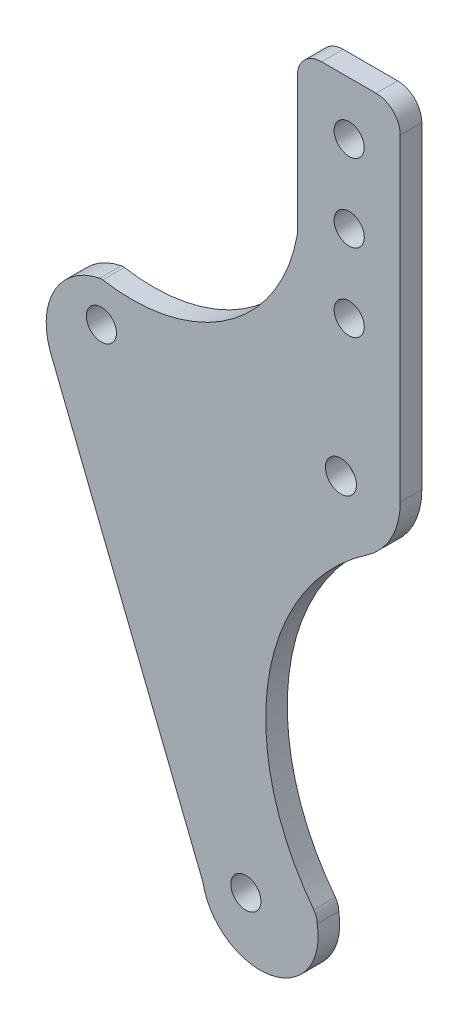
ISO-10303-21;
HEADER;
FILE_DESCRIPTION(('STEP AP214'),'2;1');
FILE_NAME('part.step','',(''),(''),'','','');
FILE_SCHEMA(('AUTOMOTIVE_DESIGN { 1 0 10303 214 1 1 1 1 }'));
ENDSEC;
DATA;
#1=APPLICATION_CONTEXT('core data for automotive mechanical design processes');
#2=APPLICATION_PROTOCOL_DEFINITION('international standard','automotive_design',2000,#1);
#3=PRODUCT_CONTEXT('',#1,'mechanical');
#4=PRODUCT('Part','Part','',(#3));
#5=PRODUCT_RELATED_PRODUCT_CATEGORY('part','',(#4));
#6=PRODUCT_DEFINITION_FORMATION('','',#4);
#7=PRODUCT_DEFINITION_CONTEXT('part definition',#1,'design');
#8=PRODUCT_DEFINITION('design','',#6,#7);
#9=PRODUCT_DEFINITION_SHAPE('','',#8);
#10=(LENGTH_UNIT() NAMED_UNIT(*) SI_UNIT(.MILLI.,.METRE.));
#11=(NAMED_UNIT(*) PLANE_ANGLE_UNIT() SI_UNIT($,.RADIAN.));
#12=(NAMED_UNIT(*) SI_UNIT($,.STERADIAN.) SOLID_ANGLE_UNIT());
#13=UNCERTAINTY_MEASURE_WITH_UNIT(LENGTH_MEASURE(1.E-05),#10,'distance_accuracy_value','');
#14=(GEOMETRIC_REPRESENTATION_CONTEXT(3) GLOBAL_UNCERTAINTY_ASSIGNED_CONTEXT((#13)) GLOBAL_UNIT_ASSIGNED_CONTEXT((#10,
#11,#12)) REPRESENTATION_CONTEXT('',''));
#15=CARTESIAN_POINT('',(0.,0.,0.));
#16=DIRECTION('',(0.,0.,1.));
#17=DIRECTION('',(1.,0.,0.));
#18=AXIS2_PLACEMENT_3D('',#15,#16,#17);
#19=CARTESIAN_POINT('',(-22.5782126898474,-20.4623195499468,3.175));
#20=DIRECTION('',(0.,0.,1.));
#21=DIRECTION('',(1.,0.,0.));
#22=AXIS2_PLACEMENT_3D('',#19,#20,#21);
#23=PLANE('',#22);
#24=CARTESIAN_POINT('',(-20.2675102016368,-21.5168908609178,3.175));
#25=DIRECTION('',(0.,0.,1.));
#26=DIRECTION('',(1.,0.,0.));
#27=AXIS2_PLACEMENT_3D('',#24,#25,#26);
#28=CIRCLE('',#27,2.286);
#29=CARTESIAN_POINT('',(-17.9815102016368,-21.5168908609178,3.175));
#30=VERTEX_POINT('',#29);
#31=EDGE_CURVE('E294',#30,#30,#28,.T.);
#32=ORIENTED_EDGE('',*,*,#31,.F.);
#33=EDGE_LOOP('',(#32));
#34=FACE_BOUND('',#33,.T.);
#35=CARTESIAN_POINT('',(-19.05,10.6549552352061,3.175));
#36=DIRECTION('',(0.,0.,1.));
#37=DIRECTION('',(1.,0.,0.));
#38=AXIS2_PLACEMENT_3D('',#35,#36,#37);
#39=CIRCLE('',#38,2.2225);
#40=CARTESIAN_POINT('',(-16.8275,10.6549552352061,3.175));
#41=VERTEX_POINT('',#40);
#42=EDGE_CURVE('E299',#41,#41,#39,.T.);
#43=ORIENTED_EDGE('',*,*,#42,.F.);
#44=EDGE_LOOP('',(#43));
#45=FACE_BOUND('',#44,.T.);
#46=CARTESIAN_POINT('',(-19.05,22.0849552352061,3.175));
#47=DIRECTION('',(0.,0.,1.));
#48=DIRECTION('',(1.,0.,0.));
#49=AXIS2_PLACEMENT_3D('',#46,#47,#48);
#50=CIRCLE('',#49,2.2225);
#51=CARTESIAN_POINT('',(-16.8275,22.0849552352061,3.175));
#52=VERTEX_POINT('',#51);
#53=EDGE_CURVE('E309',#52,#52,#50,.T.);
#54=ORIENTED_EDGE('',*,*,#53,.F.);
#55=EDGE_LOOP('',(#54));
#56=FACE_BOUND('',#55,.T.);
#57=CARTESIAN_POINT('',(-22.5782126898474,-20.4623195499468,3.175));
#58=DIRECTION('',(0.,0.,1.));
#59=DIRECTION('',(1.,0.,0.));
#60=AXIS2_PLACEMENT_3D('',#57,#58,#59);
#61=CIRCLE('',#60,11.0500735383556);
#62=CARTESIAN_POINT('',(-16.3570102645019,-29.5947215114212,3.175));
#63=VERTEX_POINT('',#62);
#64=CARTESIAN_POINT('',(-11.5281391514918,-20.4623195499468,3.175));
#65=VERTEX_POINT('',#64);
#66=EDGE_CURVE('E213',#63,#65,#61,.T.);
#67=ORIENTED_EDGE('',*,*,#66,.T.);
#68=DIRECTION('',(0.,1.,0.));
#69=VECTOR('',#68,1.);
#70=CARTESIAN_POINT('',(-11.5281391514918,-20.4623195499468,3.175));
#71=LINE('',#70,#69);
#72=CARTESIAN_POINT('',(-11.5281391514918,26.3577225871405,3.175));
#73=VERTEX_POINT('',#72);
#74=EDGE_CURVE('E127',#65,#73,#71,.T.);
#75=ORIENTED_EDGE('',*,*,#74,.T.);
#76=CARTESIAN_POINT('',(-15.0841391514918,26.3577225871405,3.175));
#77=DIRECTION('',(0.,0.,1.));
#78=DIRECTION('',(-1.,0.,0.));
#79=AXIS2_PLACEMENT_3D('',#76,#77,#78);
#80=CIRCLE('',#79,3.556);
#81=CARTESIAN_POINT('',(-15.0841391514918,29.9137225871405,3.175));
#82=VERTEX_POINT('',#81);
#83=EDGE_CURVE('E246',#73,#82,#80,.T.);
#84=ORIENTED_EDGE('',*,*,#83,.T.);
#85=DIRECTION('',(-1.,0.,0.));
#86=VECTOR('',#85,1.);
#87=CARTESIAN_POINT('',(-15.0841391514918,29.9137225871405,3.175));
#88=LINE('',#87,#86);
#89=CARTESIAN_POINT('',(-23.1269689628182,29.9137225871405,3.175));
#90=VERTEX_POINT('',#89);
#91=EDGE_CURVE('E266',#82,#90,#88,.T.);
#92=ORIENTED_EDGE('',*,*,#91,.T.);
#93=CARTESIAN_POINT('',(-23.1269689628182,26.3577225871405,3.175));
#94=DIRECTION('',(0.,0.,1.));
#95=DIRECTION('',(1.,0.,0.));
#96=AXIS2_PLACEMENT_3D('',#93,#94,#95);
#97=CIRCLE('',#96,3.556);
#98=CARTESIAN_POINT('',(-26.6829689628182,26.3577225871405,3.175));
#99=VERTEX_POINT('',#98);
#100=EDGE_CURVE('E263',#90,#99,#97,.T.);
#101=ORIENTED_EDGE('',*,*,#100,.T.);
#102=DIRECTION('',(0.,-1.,0.));
#103=VECTOR('',#102,1.);
#104=CARTESIAN_POINT('',(-26.6829689628182,26.3577225871405,3.175));
#105=LINE('',#104,#103);
#106=CARTESIAN_POINT('',(-26.6829689628181,6.35178587229873,3.175));
#107=VERTEX_POINT('',#106);
#108=EDGE_CURVE('E264',#99,#107,#105,.T.);
#109=ORIENTED_EDGE('',*,*,#108,.T.);
#110=CARTESIAN_POINT('',(-29.2229689628182,6.35178587229873,3.175));
#111=DIRECTION('',(0.,0.,-1.));
#112=DIRECTION('',(-1.,0.,0.));
#113=AXIS2_PLACEMENT_3D('',#110,#111,#112);
#114=CIRCLE('',#113,2.54);
#115=CARTESIAN_POINT('',(-26.7251145628576,5.89100024253371,3.175));
#116=VERTEX_POINT('',#115);
#117=EDGE_CURVE('E268',#107,#116,#114,.T.);
#118=ORIENTED_EDGE('',*,*,#117,.T.);
#119=CARTESIAN_POINT('',(-51.0844467454906,10.3846289426721,3.175));
#120=DIRECTION('',(0.,0.,-1.));
#121=DIRECTION('',(1.,0.,0.));
#122=AXIS2_PLACEMENT_3D('',#119,#120,#121);
#123=CIRCLE('',#122,24.770340394887);
#124=CARTESIAN_POINT('',(-55.3282039653007,-14.0194749732245,3.175));
#125=VERTEX_POINT('',#124);
#126=EDGE_CURVE('E273',#116,#125,#123,.T.);
#127=ORIENTED_EDGE('',*,*,#126,.T.);
#128=CARTESIAN_POINT('',(-55.5391522855915,-15.2325520798106,3.175));
#129=DIRECTION('',(0.,0.,1.));
#130=DIRECTION('',(1.,0.,0.));
#131=AXIS2_PLACEMENT_3D('',#128,#129,#130);
#132=CIRCLE('',#131,1.23128195810575);
#133=CARTESIAN_POINT('',(-55.7802230548623,-14.0251001575545,3.175));
#134=VERTEX_POINT('',#133);
#135=EDGE_CURVE('E280',#125,#134,#132,.T.);
#136=ORIENTED_EDGE('',*,*,#135,.T.);
#137=CARTESIAN_POINT('',(-53.857760548183,-23.6541441771838,3.175));
#138=DIRECTION('',(0.,0.,1.));
#139=DIRECTION('',(-1.,0.,0.));
#140=AXIS2_PLACEMENT_3D('',#137,#138,#139);
#141=CIRCLE('',#140,9.81908095605417);
#142=CARTESIAN_POINT('',(-63.1033724051803,-26.9606547565251,3.175));
#143=VERTEX_POINT('',#142);
#144=EDGE_CURVE('E276',#134,#143,#141,.T.);
#145=ORIENTED_EDGE('',*,*,#144,.T.);
#146=DIRECTION('',(0.370104767330601,-0.928990022120346,0.));
#147=VECTOR('',#146,1.);
#148=CARTESIAN_POINT('',(-63.1033724051803,-26.9606547565251,3.175));
#149=LINE('',#148,#147);
#150=CARTESIAN_POINT('',(-40.5959446251079,-83.4559438663901,3.175));
#151=VERTEX_POINT('',#150);
#152=EDGE_CURVE('E162',#143,#151,#149,.T.);
#153=ORIENTED_EDGE('',*,*,#152,.T.);
#154=CARTESIAN_POINT('',(-32.1769095073306,-81.9203867356407,3.175));
#155=DIRECTION('',(0.,0.,1.));
#156=DIRECTION('',(1.,0.,0.));
#157=AXIS2_PLACEMENT_3D('',#154,#155,#156);
#158=CIRCLE('',#157,8.55792545049101);
#159=CARTESIAN_POINT('',(-23.7578743895534,-80.3848296048913,3.175));
#160=VERTEX_POINT('',#159);
#161=EDGE_CURVE('E160',#151,#160,#158,.T.);
#162=ORIENTED_EDGE('',*,*,#161,.T.);
#163=CARTESIAN_POINT('',(-26.2975817528902,-80.3462743379001,3.175));
#164=DIRECTION('',(0.,0.,1.));
#165=DIRECTION('',(1.,0.,0.));
#166=AXIS2_PLACEMENT_3D('',#163,#164,#165);
#167=CIRCLE('',#166,2.54000000000001);
#168=CARTESIAN_POINT('',(-24.2808678537759,-78.8021030232075,3.175));
#169=VERTEX_POINT('',#168);
#170=EDGE_CURVE('E161',#160,#169,#167,.T.);
#171=ORIENTED_EDGE('',*,*,#170,.T.);
#172=CARTESIAN_POINT('',(2.9568838511131,-57.9465146931633,3.175));
#173=DIRECTION('',(0.,0.,-1.));
#174=DIRECTION('',(1.,0.,0.));
#175=AXIS2_PLACEMENT_3D('',#172,#173,#174);
#176=CIRCLE('',#175,34.3052573599071);
#177=EDGE_CURVE('E65',#169,#63,#176,.T.);
#178=ORIENTED_EDGE('',*,*,#177,.T.);
#179=EDGE_LOOP('',(#67,#75,#84,#92,#101,#109,#118,#127,#136,#145,#153,#162,#171,#178));
#180=FACE_BOUND('',#179,.T.);
#181=CARTESIAN_POINT('',(-55.5440786790482,-19.8249649015272,3.175));
#182=DIRECTION('',(0.,0.,1.));
#183=DIRECTION('',(1.,0.,0.));
#184=AXIS2_PLACEMENT_3D('',#181,#182,#183);
#185=CIRCLE('',#184,2.22250000000152);
#186=CARTESIAN_POINT('',(-53.3215786790467,-19.8249649015272,3.175));
#187=VERTEX_POINT('',#186);
#188=EDGE_CURVE('E187',#187,#187,#185,.T.);
#189=ORIENTED_EDGE('',*,*,#188,.F.);
#190=EDGE_LOOP('',(#189));
#191=FACE_BOUND('',#190,.T.);
#192=CARTESIAN_POINT('',(-19.05,-0.77504476479388,3.175));
#193=DIRECTION('',(0.,0.,1.));
#194=DIRECTION('',(1.,0.,0.));
#195=AXIS2_PLACEMENT_3D('',#192,#193,#194);
#196=CIRCLE('',#195,2.2225);
#197=CARTESIAN_POINT('',(-16.8275,-0.77504476479388,3.175));
#198=VERTEX_POINT('',#197);
#199=EDGE_CURVE('E303',#198,#198,#196,.T.);
#200=ORIENTED_EDGE('',*,*,#199,.F.);
#201=EDGE_LOOP('',(#200));
#202=FACE_BOUND('',#201,.T.);
#203=CARTESIAN_POINT('',(-34.2687021771766,-81.6511114563678,3.175));
#204=DIRECTION('',(0.,0.,1.));
#205=DIRECTION('',(1.,0.,0.));
#206=AXIS2_PLACEMENT_3D('',#203,#204,#205);
#207=CIRCLE('',#206,2.22250000000154);
#208=CARTESIAN_POINT('',(-32.0462021771751,-81.6511114563678,3.175));
#209=VERTEX_POINT('',#208);
#210=EDGE_CURVE('E283',#209,#209,#207,.T.);
#211=ORIENTED_EDGE('',*,*,#210,.F.);
#212=EDGE_LOOP('',(#211));
#213=FACE_BOUND('',#212,.T.);
#214=ADVANCED_FACE('F50',(#34,#45,#56,#180,#191,#202,#213),#23,.T.);
#215=CARTESIAN_POINT('',(-22.5782126898474,-20.4623195499468,0.));
#216=DIRECTION('',(0.,0.,1.));
#217=DIRECTION('',(1.,0.,0.));
#218=AXIS2_PLACEMENT_3D('',#215,#216,#217);
#219=PLANE('',#218);
#220=CARTESIAN_POINT('',(-20.2675102016368,-21.5168908609178,0.));
#221=DIRECTION('',(0.,0.,1.));
#222=DIRECTION('',(1.,0.,0.));
#223=AXIS2_PLACEMENT_3D('',#220,#221,#222);
#224=CIRCLE('',#223,2.286);
#225=CARTESIAN_POINT('',(-17.9815102016368,-21.5168908609178,0.));
#226=VERTEX_POINT('',#225);
#227=EDGE_CURVE('E285',#226,#226,#224,.T.);
#228=ORIENTED_EDGE('',*,*,#227,.T.);
#229=EDGE_LOOP('',(#228));
#230=FACE_BOUND('',#229,.T.);
#231=CARTESIAN_POINT('',(-22.5782126898474,-20.4623195499468,0.));
#232=DIRECTION('',(0.,0.,1.));
#233=DIRECTION('',(1.,0.,0.));
#234=AXIS2_PLACEMENT_3D('',#231,#232,#233);
#235=CIRCLE('',#234,11.0500735383556);
#236=CARTESIAN_POINT('',(-16.3570102645019,-29.5947215114212,0.));
#237=VERTEX_POINT('',#236);
#238=CARTESIAN_POINT('',(-11.5281391514918,-20.4623195499468,0.));
#239=VERTEX_POINT('',#238);
#240=EDGE_CURVE('E185',#237,#239,#235,.T.);
#241=ORIENTED_EDGE('',*,*,#240,.F.);
#242=CARTESIAN_POINT('',(2.9568838511131,-57.9465146931633,0.));
#243=DIRECTION('',(0.,0.,-1.));
#244=DIRECTION('',(1.,0.,0.));
#245=AXIS2_PLACEMENT_3D('',#242,#243,#244);
#246=CIRCLE('',#245,34.3052573599071);
#247=CARTESIAN_POINT('',(-24.2808678537759,-78.8021030232075,0.));
#248=VERTEX_POINT('',#247);
#249=EDGE_CURVE('E119',#248,#237,#246,.T.);
#250=ORIENTED_EDGE('',*,*,#249,.F.);
#251=CARTESIAN_POINT('',(-26.2975817528902,-80.3462743379001,0.));
#252=DIRECTION('',(0.,0.,1.));
#253=DIRECTION('',(1.,0.,0.));
#254=AXIS2_PLACEMENT_3D('',#251,#252,#253);
#255=CIRCLE('',#254,2.54000000000001);
#256=CARTESIAN_POINT('',(-23.7578743895534,-80.3848296048913,0.));
#257=VERTEX_POINT('',#256);
#258=EDGE_CURVE('E115',#257,#248,#255,.T.);
#259=ORIENTED_EDGE('',*,*,#258,.F.);
#260=CARTESIAN_POINT('',(-32.1769095073306,-81.9203867356407,0.));
#261=DIRECTION('',(0.,0.,1.));
#262=DIRECTION('',(1.,0.,0.));
#263=AXIS2_PLACEMENT_3D('',#260,#261,#262);
#264=CIRCLE('',#263,8.55792545049101);
#265=CARTESIAN_POINT('',(-40.5959446251079,-83.4559438663901,0.));
#266=VERTEX_POINT('',#265);
#267=EDGE_CURVE('E171',#266,#257,#264,.T.);
#268=ORIENTED_EDGE('',*,*,#267,.F.);
#269=DIRECTION('',(0.370104767330601,-0.928990022120346,0.));
#270=VECTOR('',#269,1.);
#271=CARTESIAN_POINT('',(-63.1033724051803,-26.9606547565251,0.));
#272=LINE('',#271,#270);
#273=CARTESIAN_POINT('',(-63.1033724051803,-26.9606547565251,0.));
#274=VERTEX_POINT('',#273);
#275=EDGE_CURVE('E206',#274,#266,#272,.T.);
#276=ORIENTED_EDGE('',*,*,#275,.F.);
#277=CARTESIAN_POINT('',(-53.857760548183,-23.6541441771838,0.));
#278=DIRECTION('',(0.,0.,1.));
#279=DIRECTION('',(-1.,0.,0.));
#280=AXIS2_PLACEMENT_3D('',#277,#278,#279);
#281=CIRCLE('',#280,9.81908095605417);
#282=CARTESIAN_POINT('',(-55.7802230548623,-14.0251001575545,0.));
#283=VERTEX_POINT('',#282);
#284=EDGE_CURVE('E204',#283,#274,#281,.T.);
#285=ORIENTED_EDGE('',*,*,#284,.F.);
#286=CARTESIAN_POINT('',(-55.5391522855915,-15.2325520798106,0.));
#287=DIRECTION('',(0.,0.,1.));
#288=DIRECTION('',(1.,0.,0.));
#289=AXIS2_PLACEMENT_3D('',#286,#287,#288);
#290=CIRCLE('',#289,1.23128195810575);
#291=CARTESIAN_POINT('',(-55.3282039653007,-14.0194749732245,0.));
#292=VERTEX_POINT('',#291);
#293=EDGE_CURVE('E205',#292,#283,#290,.T.);
#294=ORIENTED_EDGE('',*,*,#293,.F.);
#295=CARTESIAN_POINT('',(-51.0844467454906,10.3846289426721,0.));
#296=DIRECTION('',(0.,0.,-1.));
#297=DIRECTION('',(1.,0.,0.));
#298=AXIS2_PLACEMENT_3D('',#295,#296,#297);
#299=CIRCLE('',#298,24.770340394887);
#300=CARTESIAN_POINT('',(-26.7251145628576,5.89100024253371,0.));
#301=VERTEX_POINT('',#300);
#302=EDGE_CURVE('E200',#301,#292,#299,.T.);
#303=ORIENTED_EDGE('',*,*,#302,.F.);
#304=CARTESIAN_POINT('',(-29.2229689628182,6.35178587229873,0.));
#305=DIRECTION('',(0.,0.,-1.));
#306=DIRECTION('',(-1.,0.,0.));
#307=AXIS2_PLACEMENT_3D('',#304,#305,#306);
#308=CIRCLE('',#307,2.54);
#309=CARTESIAN_POINT('',(-26.6829689628181,6.35178587229873,0.));
#310=VERTEX_POINT('',#309);
#311=EDGE_CURVE('E197',#310,#301,#308,.T.);
#312=ORIENTED_EDGE('',*,*,#311,.F.);
#313=DIRECTION('',(0.,-1.,0.));
#314=VECTOR('',#313,1.);
#315=CARTESIAN_POINT('',(-26.6829689628182,26.3577225871405,0.));
#316=LINE('',#315,#314);
#317=CARTESIAN_POINT('',(-26.6829689628182,26.3577225871405,0.));
#318=VERTEX_POINT('',#317);
#319=EDGE_CURVE('E192',#318,#310,#316,.T.);
#320=ORIENTED_EDGE('',*,*,#319,.F.);
#321=CARTESIAN_POINT('',(-23.1269689628182,26.3577225871405,0.));
#322=DIRECTION('',(0.,0.,1.));
#323=DIRECTION('',(1.,0.,0.));
#324=AXIS2_PLACEMENT_3D('',#321,#322,#323);
#325=CIRCLE('',#324,3.556);
#326=CARTESIAN_POINT('',(-23.1269689628182,29.9137225871405,0.));
#327=VERTEX_POINT('',#326);
#328=EDGE_CURVE('E195',#327,#318,#325,.T.);
#329=ORIENTED_EDGE('',*,*,#328,.F.);
#330=DIRECTION('',(-1.,0.,0.));
#331=VECTOR('',#330,1.);
#332=CARTESIAN_POINT('',(-15.0841391514918,29.9137225871405,0.));
#333=LINE('',#332,#331);
#334=CARTESIAN_POINT('',(-15.0841391514918,29.9137225871405,0.));
#335=VERTEX_POINT('',#334);
#336=EDGE_CURVE('E194',#335,#327,#333,.T.);
#337=ORIENTED_EDGE('',*,*,#336,.F.);
#338=CARTESIAN_POINT('',(-15.0841391514918,26.3577225871405,0.));
#339=DIRECTION('',(0.,0.,1.));
#340=DIRECTION('',(-1.,0.,0.));
#341=AXIS2_PLACEMENT_3D('',#338,#339,#340);
#342=CIRCLE('',#341,3.556);
#343=CARTESIAN_POINT('',(-11.5281391514918,26.3577225871405,0.));
#344=VERTEX_POINT('',#343);
#345=EDGE_CURVE('E188',#344,#335,#342,.T.);
#346=ORIENTED_EDGE('',*,*,#345,.F.);
#347=DIRECTION('',(0.,1.,0.));
#348=VECTOR('',#347,1.);
#349=CARTESIAN_POINT('',(-11.5281391514918,-20.4623195499468,0.));
#350=LINE('',#349,#348);
#351=EDGE_CURVE('E186',#239,#344,#350,.T.);
#352=ORIENTED_EDGE('',*,*,#351,.F.);
#353=EDGE_LOOP('',(#241,#250,#259,#268,#276,#285,#294,#303,#312,#320,#329,#337,#346,#352));
#354=FACE_BOUND('',#353,.T.);
#355=CARTESIAN_POINT('',(-55.5440786790482,-19.8249649015272,0.));
#356=DIRECTION('',(0.,0.,1.));
#357=DIRECTION('',(1.,0.,0.));
#358=AXIS2_PLACEMENT_3D('',#355,#356,#357);
#359=CIRCLE('',#358,2.22250000000152);
#360=CARTESIAN_POINT('',(-53.3215786790467,-19.8249649015272,0.));
#361=VERTEX_POINT('',#360);
#362=EDGE_CURVE('E311',#361,#361,#359,.T.);
#363=ORIENTED_EDGE('',*,*,#362,.T.);
#364=EDGE_LOOP('',(#363));
#365=FACE_BOUND('',#364,.T.);
#366=CARTESIAN_POINT('',(-19.05,22.0849552352061,0.));
#367=DIRECTION('',(0.,0.,1.));
#368=DIRECTION('',(1.,0.,0.));
#369=AXIS2_PLACEMENT_3D('',#366,#367,#368);
#370=CIRCLE('',#369,2.2225);
#371=CARTESIAN_POINT('',(-16.8275,22.0849552352061,0.));
#372=VERTEX_POINT('',#371);
#373=EDGE_CURVE('E307',#372,#372,#370,.T.);
#374=ORIENTED_EDGE('',*,*,#373,.T.);
#375=EDGE_LOOP('',(#374));
#376=FACE_BOUND('',#375,.T.);
#377=CARTESIAN_POINT('',(-19.05,-0.77504476479388,0.));
#378=DIRECTION('',(0.,0.,1.));
#379=DIRECTION('',(1.,0.,0.));
#380=AXIS2_PLACEMENT_3D('',#377,#378,#379);
#381=CIRCLE('',#380,2.2225);
#382=CARTESIAN_POINT('',(-16.8275,-0.77504476479388,0.));
#383=VERTEX_POINT('',#382);
#384=EDGE_CURVE('E304',#383,#383,#381,.T.);
#385=ORIENTED_EDGE('',*,*,#384,.T.);
#386=EDGE_LOOP('',(#385));
#387=FACE_BOUND('',#386,.T.);
#388=CARTESIAN_POINT('',(-19.05,10.6549552352061,0.));
#389=DIRECTION('',(0.,0.,1.));
#390=DIRECTION('',(1.,0.,0.));
#391=AXIS2_PLACEMENT_3D('',#388,#389,#390);
#392=CIRCLE('',#391,2.2225);
#393=CARTESIAN_POINT('',(-16.8275,10.6549552352061,0.));
#394=VERTEX_POINT('',#393);
#395=EDGE_CURVE('E287',#394,#394,#392,.T.);
#396=ORIENTED_EDGE('',*,*,#395,.T.);
#397=EDGE_LOOP('',(#396));
#398=FACE_BOUND('',#397,.T.);
#399=CARTESIAN_POINT('',(-34.2687021771766,-81.6511114563678,0.));
#400=DIRECTION('',(0.,0.,1.));
#401=DIRECTION('',(1.,0.,0.));
#402=AXIS2_PLACEMENT_3D('',#399,#400,#401);
#403=CIRCLE('',#402,2.22250000000154);
#404=CARTESIAN_POINT('',(-32.0462021771751,-81.6511114563678,0.));
#405=VERTEX_POINT('',#404);
#406=EDGE_CURVE('E282',#405,#405,#403,.T.);
#407=ORIENTED_EDGE('',*,*,#406,.T.);
#408=EDGE_LOOP('',(#407));
#409=FACE_BOUND('',#408,.T.);
#410=ADVANCED_FACE('F253',(#230,#354,#365,#376,#387,#398,#409),#219,.F.);
#411=CARTESIAN_POINT('',(-22.5782126898474,-20.4623195499468,3.175));
#412=DIRECTION('',(0.,0.,-1.));
#413=DIRECTION('',(-1.,0.,0.));
#414=AXIS2_PLACEMENT_3D('',#411,#412,#413);
#415=CYLINDRICAL_SURFACE('',#414,11.0500735383556);
#416=ORIENTED_EDGE('',*,*,#240,.T.);
#417=DIRECTION('',(0.,0.,-1.));
#418=VECTOR('',#417,1.);
#419=CARTESIAN_POINT('',(-11.5281391514918,-20.4623195499468,3.175));
#420=LINE('',#419,#418);
#421=EDGE_CURVE('E11',#65,#239,#420,.T.);
#422=ORIENTED_EDGE('',*,*,#421,.F.);
#423=ORIENTED_EDGE('',*,*,#66,.F.);
#424=DIRECTION('',(0.,0.,-1.));
#425=VECTOR('',#424,1.);
#426=CARTESIAN_POINT('',(-16.3570102645019,-29.5947215114212,3.175));
#427=LINE('',#426,#425);
#428=EDGE_CURVE('E180',#63,#237,#427,.T.);
#429=ORIENTED_EDGE('',*,*,#428,.T.);
#430=EDGE_LOOP('',(#416,#422,#423,#429));
#431=FACE_BOUND('',#430,.T.);
#432=ADVANCED_FACE('F47',(#431),#415,.T.);
#433=CARTESIAN_POINT('',(-11.5281391514918,-20.4623195499468,3.175));
#434=DIRECTION('',(-1.,0.,0.));
#435=DIRECTION('',(0.,0.,1.));
#436=AXIS2_PLACEMENT_3D('',#433,#434,#435);
#437=PLANE('',#436);
#438=ORIENTED_EDGE('',*,*,#351,.T.);
#439=DIRECTION('',(0.,0.,-1.));
#440=VECTOR('',#439,1.);
#441=CARTESIAN_POINT('',(-11.5281391514918,26.3577225871405,3.175));
#442=LINE('',#441,#440);
#443=EDGE_CURVE('E57',#73,#344,#442,.T.);
#444=ORIENTED_EDGE('',*,*,#443,.F.);
#445=ORIENTED_EDGE('',*,*,#74,.F.);
#446=ORIENTED_EDGE('',*,*,#421,.T.);
#447=EDGE_LOOP('',(#438,#444,#445,#446));
#448=FACE_BOUND('',#447,.T.);
#449=ADVANCED_FACE('F324',(#448),#437,.F.);
#450=CARTESIAN_POINT('',(-15.0841391514918,26.3577225871405,3.175));
#451=DIRECTION('',(0.,0.,-1.));
#452=DIRECTION('',(-1.,0.,0.));
#453=AXIS2_PLACEMENT_3D('',#450,#451,#452);
#454=CYLINDRICAL_SURFACE('',#453,3.556);
#455=ORIENTED_EDGE('',*,*,#345,.T.);
#456=DIRECTION('',(0.,0.,-1.));
#457=VECTOR('',#456,1.);
#458=CARTESIAN_POINT('',(-15.0841391514918,29.9137225871405,3.175));
#459=LINE('',#458,#457);
#460=EDGE_CURVE('E239',#82,#335,#459,.T.);
#461=ORIENTED_EDGE('',*,*,#460,.F.);
#462=ORIENTED_EDGE('',*,*,#83,.F.);
#463=ORIENTED_EDGE('',*,*,#443,.T.);
#464=EDGE_LOOP('',(#455,#461,#462,#463));
#465=FACE_BOUND('',#464,.T.);
#466=ADVANCED_FACE('F245',(#465),#454,.T.);
#467=CARTESIAN_POINT('',(-15.0841391514918,29.9137225871405,3.175));
#468=DIRECTION('',(0.,-1.,0.));
#469=DIRECTION('',(1.,0.,0.));
#470=AXIS2_PLACEMENT_3D('',#467,#468,#469);
#471=PLANE('',#470);
#472=ORIENTED_EDGE('',*,*,#336,.T.);
#473=DIRECTION('',(0.,0.,-1.));
#474=VECTOR('',#473,1.);
#475=CARTESIAN_POINT('',(-23.1269689628182,29.9137225871405,3.175));
#476=LINE('',#475,#474);
#477=EDGE_CURVE('E237',#90,#327,#476,.T.);
#478=ORIENTED_EDGE('',*,*,#477,.F.);
#479=ORIENTED_EDGE('',*,*,#91,.F.);
#480=ORIENTED_EDGE('',*,*,#460,.T.);
#481=EDGE_LOOP('',(#472,#478,#479,#480));
#482=FACE_BOUND('',#481,.T.);
#483=ADVANCED_FACE('F260',(#482),#471,.F.);
#484=CARTESIAN_POINT('',(-23.1269689628182,26.3577225871405,3.175));
#485=DIRECTION('',(0.,0.,-1.));
#486=DIRECTION('',(-1.,0.,0.));
#487=AXIS2_PLACEMENT_3D('',#484,#485,#486);
#488=CYLINDRICAL_SURFACE('',#487,3.556);
#489=ORIENTED_EDGE('',*,*,#328,.T.);
#490=DIRECTION('',(0.,0.,-1.));
#491=VECTOR('',#490,1.);
#492=CARTESIAN_POINT('',(-26.6829689628182,26.3577225871405,3.175));
#493=LINE('',#492,#491);
#494=EDGE_CURVE('E235',#99,#318,#493,.T.);
#495=ORIENTED_EDGE('',*,*,#494,.F.);
#496=ORIENTED_EDGE('',*,*,#100,.F.);
#497=ORIENTED_EDGE('',*,*,#477,.T.);
#498=EDGE_LOOP('',(#489,#495,#496,#497));
#499=FACE_BOUND('',#498,.T.);
#500=ADVANCED_FACE('F261',(#499),#488,.T.);
#501=CARTESIAN_POINT('',(-26.6829689628182,26.3577225871405,3.175));
#502=DIRECTION('',(1.,0.,0.));
#503=DIRECTION('',(0.,1.,0.));
#504=AXIS2_PLACEMENT_3D('',#501,#502,#503);
#505=PLANE('',#504);
#506=ORIENTED_EDGE('',*,*,#319,.T.);
#507=DIRECTION('',(0.,0.,-1.));
#508=VECTOR('',#507,1.);
#509=CARTESIAN_POINT('',(-26.6829689628181,6.35178587229873,3.175));
#510=LINE('',#509,#508);
#511=EDGE_CURVE('E230',#107,#310,#510,.T.);
#512=ORIENTED_EDGE('',*,*,#511,.F.);
#513=ORIENTED_EDGE('',*,*,#108,.F.);
#514=ORIENTED_EDGE('',*,*,#494,.T.);
#515=EDGE_LOOP('',(#506,#512,#513,#514));
#516=FACE_BOUND('',#515,.T.);
#517=ADVANCED_FACE('F375',(#516),#505,.F.);
#518=CARTESIAN_POINT('',(-29.2229689628182,6.35178587229873,3.175));
#519=DIRECTION('',(0.,0.,-1.));
#520=DIRECTION('',(-1.,0.,0.));
#521=AXIS2_PLACEMENT_3D('',#518,#519,#520);
#522=CYLINDRICAL_SURFACE('',#521,2.54);
#523=ORIENTED_EDGE('',*,*,#311,.T.);
#524=DIRECTION('',(0.,0.,-1.));
#525=VECTOR('',#524,1.);
#526=CARTESIAN_POINT('',(-26.7251145628576,5.89100024253371,3.175));
#527=LINE('',#526,#525);
#528=EDGE_CURVE('E227',#116,#301,#527,.T.);
#529=ORIENTED_EDGE('',*,*,#528,.F.);
#530=ORIENTED_EDGE('',*,*,#117,.F.);
#531=ORIENTED_EDGE('',*,*,#511,.T.);
#532=EDGE_LOOP('',(#523,#529,#530,#531));
#533=FACE_BOUND('',#532,.T.);
#534=ADVANCED_FACE('F366',(#533),#522,.F.);
#535=CARTESIAN_POINT('',(-51.0844467454906,10.3846289426721,3.175));
#536=DIRECTION('',(0.,0.,-1.));
#537=DIRECTION('',(-1.,0.,0.));
#538=AXIS2_PLACEMENT_3D('',#535,#536,#537);
#539=CYLINDRICAL_SURFACE('',#538,24.770340394887);
#540=ORIENTED_EDGE('',*,*,#302,.T.);
#541=DIRECTION('',(0.,0.,-1.));
#542=VECTOR('',#541,1.);
#543=CARTESIAN_POINT('',(-55.3282039653007,-14.0194749732245,3.175));
#544=LINE('',#543,#542);
#545=EDGE_CURVE('E221',#125,#292,#544,.T.);
#546=ORIENTED_EDGE('',*,*,#545,.F.);
#547=ORIENTED_EDGE('',*,*,#126,.F.);
#548=ORIENTED_EDGE('',*,*,#528,.T.);
#549=EDGE_LOOP('',(#540,#546,#547,#548));
#550=FACE_BOUND('',#549,.T.);
#551=ADVANCED_FACE('F365',(#550),#539,.F.);
#552=CARTESIAN_POINT('',(-55.5391522855915,-15.2325520798106,3.175));
#553=DIRECTION('',(0.,0.,-1.));
#554=DIRECTION('',(-1.,0.,0.));
#555=AXIS2_PLACEMENT_3D('',#552,#553,#554);
#556=CYLINDRICAL_SURFACE('',#555,1.23128195810575);
#557=ORIENTED_EDGE('',*,*,#293,.T.);
#558=DIRECTION('',(0.,0.,-1.));
#559=VECTOR('',#558,1.);
#560=CARTESIAN_POINT('',(-55.7802230548623,-14.0251001575545,3.175));
#561=LINE('',#560,#559);
#562=EDGE_CURVE('E222',#134,#283,#561,.T.);
#563=ORIENTED_EDGE('',*,*,#562,.F.);
#564=ORIENTED_EDGE('',*,*,#135,.F.);
#565=ORIENTED_EDGE('',*,*,#545,.T.);
#566=EDGE_LOOP('',(#557,#563,#564,#565));
#567=FACE_BOUND('',#566,.T.);
#568=ADVANCED_FACE('F357',(#567),#556,.T.);
#569=CARTESIAN_POINT('',(-53.857760548183,-23.6541441771838,3.175));
#570=DIRECTION('',(0.,0.,-1.));
#571=DIRECTION('',(-1.,0.,0.));
#572=AXIS2_PLACEMENT_3D('',#569,#570,#571);
#573=CYLINDRICAL_SURFACE('',#572,9.81908095605417);
#574=ORIENTED_EDGE('',*,*,#284,.T.);
#575=DIRECTION('',(0.,0.,-1.));
#576=VECTOR('',#575,1.);
#577=CARTESIAN_POINT('',(-63.1033724051803,-26.9606547565251,3.175));
#578=LINE('',#577,#576);
#579=EDGE_CURVE('E217',#143,#274,#578,.T.);
#580=ORIENTED_EDGE('',*,*,#579,.F.);
#581=ORIENTED_EDGE('',*,*,#144,.F.);
#582=ORIENTED_EDGE('',*,*,#562,.T.);
#583=EDGE_LOOP('',(#574,#580,#581,#582));
#584=FACE_BOUND('',#583,.T.);
#585=ADVANCED_FACE('F359',(#584),#573,.T.);
#586=CARTESIAN_POINT('',(-63.1033724051803,-26.9606547565251,3.175));
#587=DIRECTION('',(0.928990022120346,0.370104767330601,0.));
#588=DIRECTION('',(-0.370104767330601,0.928990022120347,0.));
#589=AXIS2_PLACEMENT_3D('',#586,#587,#588);
#590=PLANE('',#589);
#591=ORIENTED_EDGE('',*,*,#275,.T.);
#592=DIRECTION('',(0.,0.,-1.));
#593=VECTOR('',#592,1.);
#594=CARTESIAN_POINT('',(-40.5959446251079,-83.4559438663901,3.175));
#595=LINE('',#594,#593);
#596=EDGE_CURVE('E172',#151,#266,#595,.T.);
#597=ORIENTED_EDGE('',*,*,#596,.F.);
#598=ORIENTED_EDGE('',*,*,#152,.F.);
#599=ORIENTED_EDGE('',*,*,#579,.T.);
#600=EDGE_LOOP('',(#591,#597,#598,#599));
#601=FACE_BOUND('',#600,.T.);
#602=ADVANCED_FACE('F354',(#601),#590,.F.);
#603=CARTESIAN_POINT('',(-32.1769095073306,-81.9203867356407,3.175));
#604=DIRECTION('',(0.,0.,-1.));
#605=DIRECTION('',(-1.,0.,0.));
#606=AXIS2_PLACEMENT_3D('',#603,#604,#605);
#607=CYLINDRICAL_SURFACE('',#606,8.55792545049101);
#608=ORIENTED_EDGE('',*,*,#267,.T.);
#609=DIRECTION('',(0.,0.,-1.));
#610=VECTOR('',#609,1.);
#611=CARTESIAN_POINT('',(-23.7578743895534,-80.3848296048913,3.175));
#612=LINE('',#611,#610);
#613=EDGE_CURVE('E169',#160,#257,#612,.T.);
#614=ORIENTED_EDGE('',*,*,#613,.F.);
#615=ORIENTED_EDGE('',*,*,#161,.F.);
#616=ORIENTED_EDGE('',*,*,#596,.T.);
#617=EDGE_LOOP('',(#608,#614,#615,#616));
#618=FACE_BOUND('',#617,.T.);
#619=ADVANCED_FACE('F166',(#618),#607,.T.);
#620=CARTESIAN_POINT('',(-26.2975817528902,-80.3462743379001,3.175));
#621=DIRECTION('',(0.,0.,-1.));
#622=DIRECTION('',(-1.,0.,0.));
#623=AXIS2_PLACEMENT_3D('',#620,#621,#622);
#624=CYLINDRICAL_SURFACE('',#623,2.54000000000001);
#625=ORIENTED_EDGE('',*,*,#258,.T.);
#626=DIRECTION('',(0.,0.,-1.));
#627=VECTOR('',#626,1.);
#628=CARTESIAN_POINT('',(-24.2808678537759,-78.8021030232075,3.175));
#629=LINE('',#628,#627);
#630=EDGE_CURVE('E174',#169,#248,#629,.T.);
#631=ORIENTED_EDGE('',*,*,#630,.F.);
#632=ORIENTED_EDGE('',*,*,#170,.F.);
#633=ORIENTED_EDGE('',*,*,#613,.T.);
#634=EDGE_LOOP('',(#625,#631,#632,#633));
#635=FACE_BOUND('',#634,.T.);
#636=ADVANCED_FACE('F175',(#635),#624,.T.);
#637=CARTESIAN_POINT('',(2.9568838511131,-57.9465146931633,3.175));
#638=DIRECTION('',(0.,0.,-1.));
#639=DIRECTION('',(-1.,0.,0.));
#640=AXIS2_PLACEMENT_3D('',#637,#638,#639);
#641=CYLINDRICAL_SURFACE('',#640,34.3052573599071);
#642=ORIENTED_EDGE('',*,*,#249,.T.);
#643=ORIENTED_EDGE('',*,*,#428,.F.);
#644=ORIENTED_EDGE('',*,*,#177,.F.);
#645=ORIENTED_EDGE('',*,*,#630,.T.);
#646=EDGE_LOOP('',(#642,#643,#644,#645));
#647=FACE_BOUND('',#646,.T.);
#648=ADVANCED_FACE('F350',(#647),#641,.F.);
#649=CARTESIAN_POINT('',(-55.5440786790482,-19.8249649015272,3.175));
#650=DIRECTION('',(0.,0.,-1.));
#651=DIRECTION('',(-1.,0.,0.));
#652=AXIS2_PLACEMENT_3D('',#649,#650,#651);
#653=CYLINDRICAL_SURFACE('',#652,2.22250000000152);
#654=ORIENTED_EDGE('',*,*,#188,.T.);
#655=EDGE_LOOP('',(#654));
#656=FACE_BOUND('',#655,.T.);
#657=ORIENTED_EDGE('',*,*,#362,.F.);
#658=EDGE_LOOP('',(#657));
#659=FACE_BOUND('',#658,.T.);
#660=ADVANCED_FACE('F343',(#656,#659),#653,.F.);
#661=CARTESIAN_POINT('',(-19.05,22.0849552352061,3.175));
#662=DIRECTION('',(0.,0.,-1.));
#663=DIRECTION('',(-1.,0.,0.));
#664=AXIS2_PLACEMENT_3D('',#661,#662,#663);
#665=CYLINDRICAL_SURFACE('',#664,2.2225);
#666=ORIENTED_EDGE('',*,*,#53,.T.);
#667=EDGE_LOOP('',(#666));
#668=FACE_BOUND('',#667,.T.);
#669=ORIENTED_EDGE('',*,*,#373,.F.);
#670=EDGE_LOOP('',(#669));
#671=FACE_BOUND('',#670,.T.);
#672=ADVANCED_FACE('F444',(#668,#671),#665,.F.);
#673=CARTESIAN_POINT('',(-19.05,-0.77504476479388,3.175));
#674=DIRECTION('',(0.,0.,-1.));
#675=DIRECTION('',(-1.,0.,0.));
#676=AXIS2_PLACEMENT_3D('',#673,#674,#675);
#677=CYLINDRICAL_SURFACE('',#676,2.2225);
#678=ORIENTED_EDGE('',*,*,#199,.T.);
#679=EDGE_LOOP('',(#678));
#680=FACE_BOUND('',#679,.T.);
#681=ORIENTED_EDGE('',*,*,#384,.F.);
#682=EDGE_LOOP('',(#681));
#683=FACE_BOUND('',#682,.T.);
#684=ADVANCED_FACE('F454',(#680,#683),#677,.F.);
#685=CARTESIAN_POINT('',(-19.05,10.6549552352061,3.175));
#686=DIRECTION('',(0.,0.,-1.));
#687=DIRECTION('',(-1.,0.,0.));
#688=AXIS2_PLACEMENT_3D('',#685,#686,#687);
#689=CYLINDRICAL_SURFACE('',#688,2.2225);
#690=ORIENTED_EDGE('',*,*,#42,.T.);
#691=EDGE_LOOP('',(#690));
#692=FACE_BOUND('',#691,.T.);
#693=ORIENTED_EDGE('',*,*,#395,.F.);
#694=EDGE_LOOP('',(#693));
#695=FACE_BOUND('',#694,.T.);
#696=ADVANCED_FACE('F459',(#692,#695),#689,.F.);
#697=CARTESIAN_POINT('',(-34.2687021771766,-81.6511114563678,3.175));
#698=DIRECTION('',(0.,0.,-1.));
#699=DIRECTION('',(-1.,0.,0.));
#700=AXIS2_PLACEMENT_3D('',#697,#698,#699);
#701=CYLINDRICAL_SURFACE('',#700,2.22250000000154);
#702=ORIENTED_EDGE('',*,*,#210,.T.);
#703=EDGE_LOOP('',(#702));
#704=FACE_BOUND('',#703,.T.);
#705=ORIENTED_EDGE('',*,*,#406,.F.);
#706=EDGE_LOOP('',(#705));
#707=FACE_BOUND('',#706,.T.);
#708=ADVANCED_FACE('F470',(#704,#707),#701,.F.);
#709=CARTESIAN_POINT('',(-20.2675102016368,-21.5168908609178,0.));
#710=DIRECTION('',(0.,0.,1.));
#711=DIRECTION('',(1.,0.,0.));
#712=AXIS2_PLACEMENT_3D('',#709,#710,#711);
#713=CYLINDRICAL_SURFACE('',#712,2.286);
#714=ORIENTED_EDGE('',*,*,#227,.F.);
#715=EDGE_LOOP('',(#714));
#716=FACE_BOUND('',#715,.T.);
#717=ORIENTED_EDGE('',*,*,#31,.T.);
#718=EDGE_LOOP('',(#717));
#719=FACE_BOUND('',#718,.T.);
#720=ADVANCED_FACE('F478',(#716,#719),#713,.F.);
#721=CLOSED_SHELL('',(#214,#410,#432,#449,#466,#483,#500,#517,#534,#551,#568,#585,#602,#619,
#636,#648,#660,#672,#684,#696,#708,#720));
#722=MANIFOLD_SOLID_BREP('B2',#721);
#723=ADVANCED_BREP_SHAPE_REPRESENTATION('',(#18,#722),#14);
#724=SHAPE_DEFINITION_REPRESENTATION(#9,#723);
ENDSEC;
END-ISO-10303-21;
